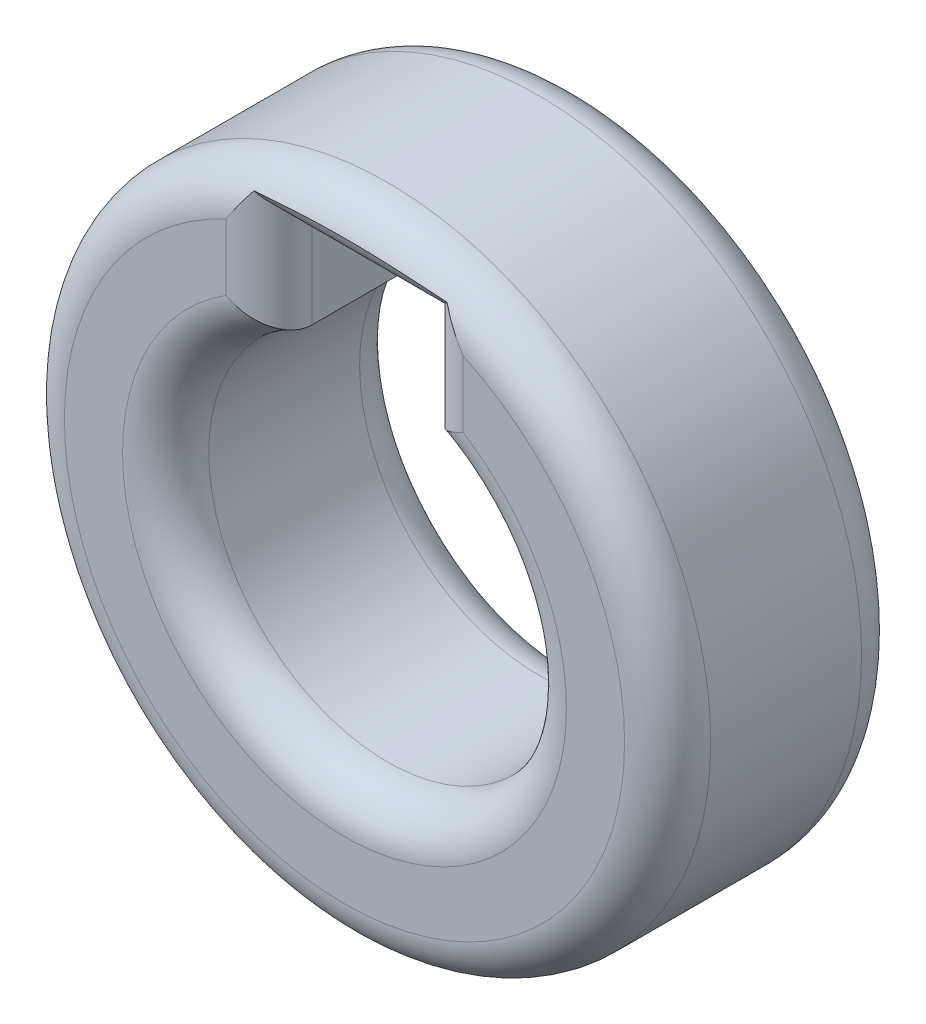
ISO-10303-21;
HEADER;
FILE_DESCRIPTION(('STEP AP214'),'2;1');
FILE_NAME('part.step','',(''),(''),'','','');
FILE_SCHEMA(('AUTOMOTIVE_DESIGN { 1 0 10303 214 1 1 1 1 }'));
ENDSEC;
DATA;
#1=APPLICATION_CONTEXT('core data for automotive mechanical design processes');
#2=APPLICATION_PROTOCOL_DEFINITION('international standard','automotive_design',2000,#1);
#3=PRODUCT_CONTEXT('',#1,'mechanical');
#4=PRODUCT('Part','Part','',(#3));
#5=PRODUCT_RELATED_PRODUCT_CATEGORY('part','',(#4));
#6=PRODUCT_DEFINITION_FORMATION('','',#4);
#7=PRODUCT_DEFINITION_CONTEXT('part definition',#1,'design');
#8=PRODUCT_DEFINITION('design','',#6,#7);
#9=PRODUCT_DEFINITION_SHAPE('','',#8);
#10=(LENGTH_UNIT() NAMED_UNIT(*) SI_UNIT(.MILLI.,.METRE.));
#11=(NAMED_UNIT(*) PLANE_ANGLE_UNIT() SI_UNIT($,.RADIAN.));
#12=(NAMED_UNIT(*) SI_UNIT($,.STERADIAN.) SOLID_ANGLE_UNIT());
#13=UNCERTAINTY_MEASURE_WITH_UNIT(LENGTH_MEASURE(1.E-05),#10,'distance_accuracy_value','');
#14=(GEOMETRIC_REPRESENTATION_CONTEXT(3) GLOBAL_UNCERTAINTY_ASSIGNED_CONTEXT((#13)) GLOBAL_UNIT_ASSIGNED_CONTEXT((#10,
#11,#12)) REPRESENTATION_CONTEXT('',''));
#15=CARTESIAN_POINT('',(0.,0.,0.));
#16=DIRECTION('',(0.,0.,1.));
#17=DIRECTION('',(1.,0.,0.));
#18=AXIS2_PLACEMENT_3D('',#15,#16,#17);
#19=CARTESIAN_POINT('',(0.,0.,5.5));
#20=DIRECTION('',(0.,0.,-1.));
#21=DIRECTION('',(-1.,0.,0.));
#22=AXIS2_PLACEMENT_3D('',#19,#20,#21);
#23=CYLINDRICAL_SURFACE('',#22,4.15);
#24=DIRECTION('',(0.,0.,-1.));
#25=VECTOR('',#24,1.);
#26=CARTESIAN_POINT('',(1.75,3.76297754444536,5.5));
#27=LINE('',#26,#25);
#28=CARTESIAN_POINT('',(1.75,3.76297754444536,4.5));
#29=VERTEX_POINT('',#28);
#30=CARTESIAN_POINT('',(1.75,3.76297754444536,1.));
#31=VERTEX_POINT('',#30);
#32=EDGE_CURVE('E212',#29,#31,#27,.T.);
#33=ORIENTED_EDGE('',*,*,#32,.T.);
#34=CARTESIAN_POINT('',(0.,0.,1.));
#35=DIRECTION('',(0.,0.,1.));
#36=DIRECTION('',(1.,0.,0.));
#37=AXIS2_PLACEMENT_3D('',#34,#35,#36);
#38=CIRCLE('',#37,4.15);
#39=CARTESIAN_POINT('',(-1.75,3.76297754444536,1.));
#40=VERTEX_POINT('',#39);
#41=EDGE_CURVE('E318',#31,#40,#38,.F.);
#42=ORIENTED_EDGE('',*,*,#41,.T.);
#43=DIRECTION('',(0.,0.,-1.));
#44=VECTOR('',#43,1.);
#45=CARTESIAN_POINT('',(-1.75,3.76297754444536,5.5));
#46=LINE('',#45,#44);
#47=CARTESIAN_POINT('',(-1.75,3.76297754444536,4.5));
#48=VERTEX_POINT('',#47);
#49=EDGE_CURVE('E334',#48,#40,#46,.T.);
#50=ORIENTED_EDGE('',*,*,#49,.F.);
#51=CARTESIAN_POINT('',(0.,0.,4.5));
#52=DIRECTION('',(0.,0.,1.));
#53=DIRECTION('',(1.,0.,0.));
#54=AXIS2_PLACEMENT_3D('',#51,#52,#53);
#55=CIRCLE('',#54,4.15);
#56=EDGE_CURVE('E316',#48,#29,#55,.T.);
#57=ORIENTED_EDGE('',*,*,#56,.T.);
#58=EDGE_LOOP('',(#33,#42,#50,#57));
#59=FACE_BOUND('',#58,.T.);
#60=ADVANCED_FACE('F43',(#59),#23,.F.);
#61=CARTESIAN_POINT('',(-1.75,0.,5.5));
#62=DIRECTION('',(-1.,0.,0.));
#63=DIRECTION('',(0.,0.,1.));
#64=AXIS2_PLACEMENT_3D('',#61,#62,#63);
#65=PLANE('',#64);
#66=ORIENTED_EDGE('',*,*,#49,.T.);
#67=DIRECTION('',(0.,1.,0.));
#68=VECTOR('',#67,1.);
#69=CARTESIAN_POINT('',(-1.75,0.,1.));
#70=LINE('',#69,#68);
#71=CARTESIAN_POINT('',(-1.75,6.15,1.));
#72=VERTEX_POINT('',#71);
#73=EDGE_CURVE('E303',#40,#72,#70,.T.);
#74=ORIENTED_EDGE('',*,*,#73,.T.);
#75=DIRECTION('',(0.,0.,-1.));
#76=VECTOR('',#75,1.);
#77=CARTESIAN_POINT('',(-1.75,6.15,5.5));
#78=LINE('',#77,#76);
#79=CARTESIAN_POINT('',(-1.75,6.15,4.5));
#80=VERTEX_POINT('',#79);
#81=EDGE_CURVE('E332',#80,#72,#78,.T.);
#82=ORIENTED_EDGE('',*,*,#81,.F.);
#83=DIRECTION('',(0.,1.,0.));
#84=VECTOR('',#83,1.);
#85=CARTESIAN_POINT('',(-1.75,3.76297754444536,4.5));
#86=LINE('',#85,#84);
#87=EDGE_CURVE('E299',#80,#48,#86,.F.);
#88=ORIENTED_EDGE('',*,*,#87,.T.);
#89=EDGE_LOOP('',(#66,#74,#82,#88));
#90=FACE_BOUND('',#89,.T.);
#91=ADVANCED_FACE('F148',(#90),#65,.F.);
#92=CARTESIAN_POINT('',(0.,6.15,5.5));
#93=DIRECTION('',(0.,1.,0.));
#94=DIRECTION('',(0.,0.,1.));
#95=AXIS2_PLACEMENT_3D('',#92,#93,#94);
#96=PLANE('',#95);
#97=ORIENTED_EDGE('',*,*,#81,.T.);
#98=DIRECTION('',(1.,0.,0.));
#99=VECTOR('',#98,1.);
#100=CARTESIAN_POINT('',(0.,6.15,1.));
#101=LINE('',#100,#99);
#102=CARTESIAN_POINT('',(1.75,6.15,1.));
#103=VERTEX_POINT('',#102);
#104=EDGE_CURVE('E238',#72,#103,#101,.T.);
#105=ORIENTED_EDGE('',*,*,#104,.T.);
#106=DIRECTION('',(0.,0.,-1.));
#107=VECTOR('',#106,1.);
#108=CARTESIAN_POINT('',(1.75,6.15,5.5));
#109=LINE('',#108,#107);
#110=CARTESIAN_POINT('',(1.75,6.15,4.5));
#111=VERTEX_POINT('',#110);
#112=EDGE_CURVE('E329',#111,#103,#109,.T.);
#113=ORIENTED_EDGE('',*,*,#112,.F.);
#114=DIRECTION('',(1.,0.,0.));
#115=VECTOR('',#114,1.);
#116=CARTESIAN_POINT('',(-1.75,6.15,4.5));
#117=LINE('',#116,#115);
#118=EDGE_CURVE('E98',#111,#80,#117,.F.);
#119=ORIENTED_EDGE('',*,*,#118,.T.);
#120=EDGE_LOOP('',(#97,#105,#113,#119));
#121=FACE_BOUND('',#120,.T.);
#122=ADVANCED_FACE('F154',(#121),#96,.F.);
#123=CARTESIAN_POINT('',(1.75,0.,5.5));
#124=DIRECTION('',(-1.,0.,0.));
#125=DIRECTION('',(0.,0.,1.));
#126=AXIS2_PLACEMENT_3D('',#123,#124,#125);
#127=PLANE('',#126);
#128=ORIENTED_EDGE('',*,*,#112,.T.);
#129=DIRECTION('',(0.,1.,0.));
#130=VECTOR('',#129,1.);
#131=CARTESIAN_POINT('',(1.75,3.76297754444536,1.));
#132=LINE('',#131,#130);
#133=EDGE_CURVE('E314',#103,#31,#132,.F.);
#134=ORIENTED_EDGE('',*,*,#133,.T.);
#135=ORIENTED_EDGE('',*,*,#32,.F.);
#136=DIRECTION('',(0.,1.,0.));
#137=VECTOR('',#136,1.);
#138=CARTESIAN_POINT('',(1.75,0.,4.5));
#139=LINE('',#138,#137);
#140=EDGE_CURVE('E312',#29,#111,#139,.T.);
#141=ORIENTED_EDGE('',*,*,#140,.T.);
#142=EDGE_LOOP('',(#128,#134,#135,#141));
#143=FACE_BOUND('',#142,.T.);
#144=ADVANCED_FACE('F328',(#143),#127,.T.);
#145=CARTESIAN_POINT('',(0.,0.,5.5));
#146=DIRECTION('',(0.,0.,-1.));
#147=DIRECTION('',(-1.,0.,0.));
#148=AXIS2_PLACEMENT_3D('',#145,#146,#147);
#149=CYLINDRICAL_SURFACE('',#148,7.5);
#150=CARTESIAN_POINT('',(0.,0.,1.));
#151=DIRECTION('',(0.,0.,1.));
#152=DIRECTION('',(1.,0.,0.));
#153=AXIS2_PLACEMENT_3D('',#150,#151,#152);
#154=CIRCLE('',#153,7.5);
#155=CARTESIAN_POINT('',(7.5,0.,1.));
#156=VERTEX_POINT('',#155);
#157=EDGE_CURVE('E342',#156,#156,#154,.T.);
#158=ORIENTED_EDGE('',*,*,#157,.T.);
#159=EDGE_LOOP('',(#158));
#160=FACE_BOUND('',#159,.T.);
#161=CARTESIAN_POINT('',(0.,0.,4.5));
#162=DIRECTION('',(0.,0.,1.));
#163=DIRECTION('',(1.,0.,0.));
#164=AXIS2_PLACEMENT_3D('',#161,#162,#163);
#165=CIRCLE('',#164,7.5);
#166=CARTESIAN_POINT('',(7.5,0.,4.5));
#167=VERTEX_POINT('',#166);
#168=EDGE_CURVE('E339',#167,#167,#165,.F.);
#169=ORIENTED_EDGE('',*,*,#168,.T.);
#170=EDGE_LOOP('',(#169));
#171=FACE_BOUND('',#170,.T.);
#172=ADVANCED_FACE('F364',(#160,#171),#149,.T.);
#173=CARTESIAN_POINT('',(0.,0.,5.5));
#174=DIRECTION('',(0.,0.,1.));
#175=DIRECTION('',(1.,0.,0.));
#176=AXIS2_PLACEMENT_3D('',#173,#174,#175);
#177=PLANE('',#176);
#178=DIRECTION('',(0.,1.,0.));
#179=VECTOR('',#178,1.);
#180=CARTESIAN_POINT('',(-2.75,6.15,5.5));
#181=LINE('',#180,#179);
#182=CARTESIAN_POINT('',(-2.75,4.35430821141545,5.5));
#183=VERTEX_POINT('',#182);
#184=CARTESIAN_POINT('',(-2.75,5.88960949469487,5.5));
#185=VERTEX_POINT('',#184);
#186=EDGE_CURVE('E292',#183,#185,#181,.T.);
#187=ORIENTED_EDGE('',*,*,#186,.T.);
#188=CARTESIAN_POINT('',(0.,0.,5.5));
#189=DIRECTION('',(0.,0.,1.));
#190=DIRECTION('',(1.,0.,0.));
#191=AXIS2_PLACEMENT_3D('',#188,#189,#190);
#192=CIRCLE('',#191,6.5);
#193=CARTESIAN_POINT('',(6.5,0.,5.5));
#194=VERTEX_POINT('',#193);
#195=EDGE_CURVE('E11',#185,#194,#192,.T.);
#196=ORIENTED_EDGE('',*,*,#195,.T.);
#197=CARTESIAN_POINT('',(0.,0.,5.5));
#198=DIRECTION('',(0.,0.,1.));
#199=DIRECTION('',(1.,0.,0.));
#200=AXIS2_PLACEMENT_3D('',#197,#198,#199);
#201=CIRCLE('',#200,6.5);
#202=CARTESIAN_POINT('',(2.75,5.88960949469487,5.5));
#203=VERTEX_POINT('',#202);
#204=EDGE_CURVE('E59',#194,#203,#201,.T.);
#205=ORIENTED_EDGE('',*,*,#204,.T.);
#206=DIRECTION('',(0.,1.,0.));
#207=VECTOR('',#206,1.);
#208=CARTESIAN_POINT('',(2.75,0.,5.5));
#209=LINE('',#208,#207);
#210=CARTESIAN_POINT('',(2.75,4.35430821141545,5.5));
#211=VERTEX_POINT('',#210);
#212=EDGE_CURVE('E107',#203,#211,#209,.F.);
#213=ORIENTED_EDGE('',*,*,#212,.T.);
#214=CARTESIAN_POINT('',(0.,0.,5.5));
#215=DIRECTION('',(0.,0.,1.));
#216=DIRECTION('',(1.,0.,0.));
#217=AXIS2_PLACEMENT_3D('',#214,#215,#216);
#218=CIRCLE('',#217,5.15);
#219=EDGE_CURVE('E295',#211,#183,#218,.F.);
#220=ORIENTED_EDGE('',*,*,#219,.T.);
#221=EDGE_LOOP('',(#187,#196,#205,#213,#220));
#222=FACE_BOUND('',#221,.T.);
#223=ADVANCED_FACE('F293',(#222),#177,.T.);
#224=CARTESIAN_POINT('',(0.,0.,0.));
#225=DIRECTION('',(0.,0.,1.));
#226=DIRECTION('',(1.,0.,0.));
#227=AXIS2_PLACEMENT_3D('',#224,#225,#226);
#228=PLANE('',#227);
#229=DIRECTION('',(0.,1.,0.));
#230=VECTOR('',#229,1.);
#231=CARTESIAN_POINT('',(2.75,6.15,0.));
#232=LINE('',#231,#230);
#233=CARTESIAN_POINT('',(2.75,4.35430821141545,0.));
#234=VERTEX_POINT('',#233);
#235=CARTESIAN_POINT('',(2.75,5.88960949469487,0.));
#236=VERTEX_POINT('',#235);
#237=EDGE_CURVE('E256',#234,#236,#232,.T.);
#238=ORIENTED_EDGE('',*,*,#237,.T.);
#239=CARTESIAN_POINT('',(0.,0.,0.));
#240=DIRECTION('',(0.,0.,1.));
#241=DIRECTION('',(1.,0.,0.));
#242=AXIS2_PLACEMENT_3D('',#239,#240,#241);
#243=CIRCLE('',#242,6.5);
#244=CARTESIAN_POINT('',(6.5,0.,0.));
#245=VERTEX_POINT('',#244);
#246=EDGE_CURVE('E252',#236,#245,#243,.F.);
#247=ORIENTED_EDGE('',*,*,#246,.T.);
#248=CARTESIAN_POINT('',(0.,0.,0.));
#249=DIRECTION('',(0.,0.,1.));
#250=DIRECTION('',(1.,0.,0.));
#251=AXIS2_PLACEMENT_3D('',#248,#249,#250);
#252=CIRCLE('',#251,6.5);
#253=CARTESIAN_POINT('',(-2.75,5.88960949469487,0.));
#254=VERTEX_POINT('',#253);
#255=EDGE_CURVE('E306',#245,#254,#252,.F.);
#256=ORIENTED_EDGE('',*,*,#255,.T.);
#257=DIRECTION('',(0.,1.,0.));
#258=VECTOR('',#257,1.);
#259=CARTESIAN_POINT('',(-2.75,0.,0.));
#260=LINE('',#259,#258);
#261=CARTESIAN_POINT('',(-2.75,4.35430821141545,0.));
#262=VERTEX_POINT('',#261);
#263=EDGE_CURVE('E245',#254,#262,#260,.F.);
#264=ORIENTED_EDGE('',*,*,#263,.T.);
#265=CARTESIAN_POINT('',(0.,0.,0.));
#266=DIRECTION('',(0.,0.,1.));
#267=DIRECTION('',(1.,0.,0.));
#268=AXIS2_PLACEMENT_3D('',#265,#266,#267);
#269=CIRCLE('',#268,5.15);
#270=EDGE_CURVE('E345',#262,#234,#269,.T.);
#271=ORIENTED_EDGE('',*,*,#270,.T.);
#272=EDGE_LOOP('',(#238,#247,#256,#264,#271));
#273=FACE_BOUND('',#272,.T.);
#274=ADVANCED_FACE('F217',(#273),#228,.F.);
#275=CARTESIAN_POINT('',(0.,0.,1.));
#276=DIRECTION('',(0.,0.,1.));
#277=DIRECTION('',(1.,0.,0.));
#278=AXIS2_PLACEMENT_3D('',#275,#276,#277);
#279=TOROIDAL_SURFACE('',#278,5.15,1.);
#280=CARTESIAN_POINT('',(1.75,3.76297754444536,1.));
#281=CARTESIAN_POINT('',(1.7499981650989,3.76297589305531,0.974890597380254));
#282=CARTESIAN_POINT('',(1.75094644884971,3.76358122590374,0.949794756188236));
#283=CARTESIAN_POINT('',(1.75471608797096,3.7659845221371,0.899812148123677));
#284=CARTESIAN_POINT('',(1.75753664559124,3.76778197757469,0.87492529677487));
#285=CARTESIAN_POINT('',(1.76872278741733,3.77490303402179,0.801112113064373));
#286=CARTESIAN_POINT('',(1.77981358390616,3.78195588829117,0.752731059950584));
#287=CARTESIAN_POINT('',(1.80867093995535,3.80022397196854,0.658959010597946));
#288=CARTESIAN_POINT('',(1.82642888829474,3.8114338320046,0.613564245804047));
#289=CARTESIAN_POINT('',(1.86783252830909,3.83741638361751,0.526605437256069));
#290=CARTESIAN_POINT('',(1.8914847766419,3.85219304222466,0.485045730538505));
#291=CARTESIAN_POINT('',(1.94547489257358,3.88568869519624,0.403960953961721));
#292=CARTESIAN_POINT('',(1.97614436825511,3.90459981472035,0.364737554324254));
#293=CARTESIAN_POINT('',(2.04213552981483,3.94495348613904,0.291943592676149));
#294=CARTESIAN_POINT('',(2.07745829740261,3.96639662650958,0.258374349184192));
#295=CARTESIAN_POINT('',(2.15737912363359,4.01448364219269,0.192621248996918));
#296=CARTESIAN_POINT('',(2.20257558601814,4.04142692787674,0.161383684127763));
#297=CARTESIAN_POINT('',(2.29671415208818,4.09695015171803,0.10697577038091));
#298=CARTESIAN_POINT('',(2.34566044392152,4.12553191063396,0.0838146070175676));
#299=CARTESIAN_POINT('',(2.45171814139658,4.18679896314791,0.0436580463607924));
#300=CARTESIAN_POINT('',(2.50913401210156,4.21958859549152,0.0276273376138794));
#301=CARTESIAN_POINT('',(2.62566587920836,4.28535578779777,0.00599809910818859));
#302=CARTESIAN_POINT('',(2.68477754786199,4.31833272237912,0.000375061453325152));
#303=CARTESIAN_POINT('',(2.74598441500649,4.35209449041624,6.03539937223928E-06));
#304=CARTESIAN_POINT('',(2.7479921732894,4.35320154529635,-1.23657262195745E-08));
#305=CARTESIAN_POINT('',(2.75,4.35430821141545,0.));
#306=B_SPLINE_CURVE_WITH_KNOTS('',3,(#280,#281,#282,#283,#284,#285,#286,#287,#288,#289,#290,
#291,#292,#293,#294,#295,#296,#297,#298,#299,#300,#301,#302,#303,#304,#305),.UNSPECIFIED.,.F.,
.F.,(4,2,2,2,2,2,2,2,2,2,2,2,4),(0.,0.0752768205510819,0.150521587254217,0.300117569183418,
0.44952099556945,0.599091361913276,0.758259120238059,0.917463944389839,1.10031467387707,
1.28337269141085,1.48666782993478,1.68948363873516,1.69636185050421),.UNSPECIFIED.);
#307=EDGE_CURVE('E221',#234,#31,#306,.F.);
#308=ORIENTED_EDGE('',*,*,#307,.F.);
#309=ORIENTED_EDGE('',*,*,#270,.F.);
#310=CARTESIAN_POINT('',(-1.75,3.76297754444536,1.));
#311=CARTESIAN_POINT('',(-1.7499981650989,3.76297589305531,0.974890597380254));
#312=CARTESIAN_POINT('',(-1.75094644884971,3.76358122590374,0.949794756188236));
#313=CARTESIAN_POINT('',(-1.75471608797096,3.7659845221371,0.899812148123677));
#314=CARTESIAN_POINT('',(-1.75753664559124,3.76778197757469,0.87492529677487));
#315=CARTESIAN_POINT('',(-1.76872278741733,3.77490303402179,0.801112113064373));
#316=CARTESIAN_POINT('',(-1.77981358390616,3.78195588829117,0.752731059950584));
#317=CARTESIAN_POINT('',(-1.80867093995535,3.80022397196854,0.658959010597946));
#318=CARTESIAN_POINT('',(-1.82642888829474,3.8114338320046,0.613564245804047));
#319=CARTESIAN_POINT('',(-1.86783252830909,3.83741638361751,0.526605437256069));
#320=CARTESIAN_POINT('',(-1.8914847766419,3.85219304222466,0.485045730538505));
#321=CARTESIAN_POINT('',(-1.94547489257358,3.88568869519624,0.403960953961721));
#322=CARTESIAN_POINT('',(-1.97614436825511,3.90459981472035,0.364737554324254));
#323=CARTESIAN_POINT('',(-2.04213552981483,3.94495348613904,0.291943592676149));
#324=CARTESIAN_POINT('',(-2.07745829740261,3.96639662650958,0.258374349184192));
#325=CARTESIAN_POINT('',(-2.15737912363359,4.01448364219269,0.192621248996918));
#326=CARTESIAN_POINT('',(-2.20257558601814,4.04142692787674,0.161383684127763));
#327=CARTESIAN_POINT('',(-2.29671415208818,4.09695015171803,0.10697577038091));
#328=CARTESIAN_POINT('',(-2.34566044392152,4.12553191063396,0.0838146070175676));
#329=CARTESIAN_POINT('',(-2.45171814139658,4.18679896314791,0.0436580463607924));
#330=CARTESIAN_POINT('',(-2.50913401210156,4.21958859549152,0.0276273376138794));
#331=CARTESIAN_POINT('',(-2.62566587920836,4.28535578779777,0.00599809910818859));
#332=CARTESIAN_POINT('',(-2.68477754786199,4.31833272237912,0.000375061453325152));
#333=CARTESIAN_POINT('',(-2.74598441500649,4.35209449041624,6.03539937223928E-06));
#334=CARTESIAN_POINT('',(-2.7479921732894,4.35320154529635,-1.23657262195745E-08));
#335=CARTESIAN_POINT('',(-2.75,4.35430821141545,0.));
#336=B_SPLINE_CURVE_WITH_KNOTS('',3,(#310,#311,#312,#313,#314,#315,#316,#317,#318,#319,#320,
#321,#322,#323,#324,#325,#326,#327,#328,#329,#330,#331,#332,#333,#334,#335),.UNSPECIFIED.,.F.,
.F.,(4,2,2,2,2,2,2,2,2,2,2,2,4),(0.,0.0752768205510819,0.150521587254217,0.300117569183418,
0.44952099556945,0.599091361913276,0.758259120238059,0.917463944389839,1.10031467387707,
1.28337269141085,1.48666782993478,1.68948363873516,1.69636185050421),.UNSPECIFIED.);
#337=EDGE_CURVE('E205',#40,#262,#336,.T.);
#338=ORIENTED_EDGE('',*,*,#337,.F.);
#339=ORIENTED_EDGE('',*,*,#41,.F.);
#340=EDGE_LOOP('',(#308,#309,#338,#339));
#341=FACE_BOUND('',#340,.T.);
#342=ADVANCED_FACE('F200',(#341),#279,.T.);
#343=CARTESIAN_POINT('',(-2.75,0.,1.));
#344=DIRECTION('',(0.,1.,0.));
#345=DIRECTION('',(0.,0.,1.));
#346=AXIS2_PLACEMENT_3D('',#343,#344,#345);
#347=CYLINDRICAL_SURFACE('',#346,1.);
#348=CARTESIAN_POINT('',(-2.75,7.15,1.));
#349=DIRECTION('',(0.707106781186547,0.707106781186547,0.));
#350=DIRECTION('',(-0.707106781186547,0.707106781186547,0.));
#351=AXIS2_PLACEMENT_3D('',#348,#349,#350);
#352=ELLIPSE('',#351,1.41421356237309,1.);
#353=CARTESIAN_POINT('',(-2.24103520856684,6.6410352085701,0.139212662102468));
#354=VERTEX_POINT('',#353);
#355=EDGE_CURVE('E213',#72,#354,#352,.T.);
#356=ORIENTED_EDGE('',*,*,#355,.F.);
#357=ORIENTED_EDGE('',*,*,#73,.F.);
#358=ORIENTED_EDGE('',*,*,#337,.T.);
#359=ORIENTED_EDGE('',*,*,#263,.F.);
#360=CARTESIAN_POINT('',(-1.86146702486486,7.1502,0.541187236339807));
#361=CARTESIAN_POINT('',(-1.87559638858256,7.13192232924319,0.513840750082381));
#362=CARTESIAN_POINT('',(-1.89060859850029,7.11243026464115,0.487846445560126));
#363=CARTESIAN_POINT('',(-1.92200808328664,7.07147550242863,0.438497403278339));
#364=CARTESIAN_POINT('',(-1.93839151885153,7.05001829212966,0.415135698691671));
#365=CARTESIAN_POINT('',(-1.98873873549848,6.98374965635293,0.349216621753408));
#366=CARTESIAN_POINT('',(-2.02424968041598,6.93659029898192,0.310186852180758));
#367=CARTESIAN_POINT('',(-2.08806390823411,6.85088771223275,0.249501855619866));
#368=CARTESIAN_POINT('',(-2.11586977643266,6.81325107882872,0.225960304296877));
#369=CARTESIAN_POINT('',(-2.17227378513499,6.73623925205052,0.183001050280347));
#370=CARTESIAN_POINT('',(-2.2008722201681,6.69686340904371,0.163584904521267));
#371=CARTESIAN_POINT('',(-2.28764468180475,6.5762857884588,0.110703324422903));
#372=CARTESIAN_POINT('',(-2.34647634606718,6.49306122046015,0.0828906173319567));
#373=CARTESIAN_POINT('',(-2.46293969864218,6.32495763589424,0.0401183996782335));
#374=CARTESIAN_POINT('',(-2.52057474590004,6.24013101085868,0.024947854916163));
#375=CARTESIAN_POINT('',(-2.63458596867698,6.06877038867327,0.00500495844337888));
#376=CARTESIAN_POINT('',(-2.69096517820919,5.98224174673416,0.000204038983962364));
#377=CARTESIAN_POINT('',(-2.74762060781749,5.89334559339342,2.12935929159164E-06));
#378=CARTESIAN_POINT('',(-2.74881051622496,5.89147765683422,7.35748526467842E-09));
#379=CARTESIAN_POINT('',(-2.75,5.88960949469487,0.));
#380=B_SPLINE_CURVE_WITH_KNOTS('',3,(#360,#361,#362,#363,#364,#365,#366,#367,#368,#369,#370,
#371,#372,#373,#374,#375,#376,#377,#378,#379),.UNSPECIFIED.,.F.,.F.,(4,2,2,2,2,2,2,2,2,4),(0.,
0.107239168736966,0.214187525933709,0.425553010555847,0.582514970787307,0.739536063897652,
1.05537339786217,1.36582643693169,1.67542309819354,1.68206731252517),.UNSPECIFIED.);
#381=EDGE_CURVE('E182',#354,#254,#380,.T.);
#382=ORIENTED_EDGE('',*,*,#381,.F.);
#383=EDGE_LOOP('',(#356,#357,#358,#359,#382));
#384=FACE_BOUND('',#383,.T.);
#385=ADVANCED_FACE('F194',(#384),#347,.T.);
#386=CARTESIAN_POINT('',(0.,7.15,1.));
#387=DIRECTION('',(1.,0.,0.));
#388=DIRECTION('',(0.,0.,-1.));
#389=AXIS2_PLACEMENT_3D('',#386,#387,#388);
#390=CYLINDRICAL_SURFACE('',#389,1.);
#391=CARTESIAN_POINT('',(2.75,7.15,1.));
#392=DIRECTION('',(0.707106781186547,-0.707106781186547,0.));
#393=DIRECTION('',(0.707106781186547,0.707106781186547,0.));
#394=AXIS2_PLACEMENT_3D('',#391,#392,#393);
#395=ELLIPSE('',#394,1.41421356237309,1.);
#396=CARTESIAN_POINT('',(2.24103520857691,6.64103520855952,0.139212662098445));
#397=VERTEX_POINT('',#396);
#398=EDGE_CURVE('E227',#103,#397,#395,.T.);
#399=ORIENTED_EDGE('',*,*,#398,.F.);
#400=ORIENTED_EDGE('',*,*,#104,.F.);
#401=ORIENTED_EDGE('',*,*,#355,.T.);
#402=CARTESIAN_POINT('',(2.7502,6.54794505347985,0.201545341693955));
#403=CARTESIAN_POINT('',(2.66168994907019,6.56577997271544,0.188126906351699));
#404=CARTESIAN_POINT('',(2.57281304207018,6.58282415497109,0.176181101154756));
#405=CARTESIAN_POINT('',(2.39448519094225,6.61527013571725,0.154746161659166));
#406=CARTESIAN_POINT('',(2.30503438897179,6.63067232546133,0.145256441352308));
#407=CARTESIAN_POINT('',(2.12576613984221,6.65976735719923,0.128247693299448));
#408=CARTESIAN_POINT('',(2.03594915148816,6.6734619014668,0.120726694666865));
#409=CARTESIAN_POINT('',(1.85594500536748,6.69912344448222,0.107296426079665));
#410=CARTESIAN_POINT('',(1.76575782230259,6.71109032307376,0.101387268200521));
#411=CARTESIAN_POINT('',(1.49660033160319,6.7441264784836,0.0857438718420197));
#412=CARTESIAN_POINT('',(1.31719673726847,6.76262990135993,0.0779325420041025));
#413=CARTESIAN_POINT('',(0.957613803214204,6.79259422016758,0.0659131291122359));
#414=CARTESIAN_POINT('',(0.777434149445223,6.80405192834414,0.0617066767064426));
#415=CARTESIAN_POINT('',(0.457847057222086,6.81803174389284,0.0566889530493467));
#416=CARTESIAN_POINT('',(0.318509381583504,6.82199549414721,0.0553222712447541));
#417=CARTESIAN_POINT('',(0.0397663944019051,6.82565356239278,0.0540592461096876));
#418=CARTESIAN_POINT('',(-0.0996389188843264,6.82534776378266,0.0541629429352361));
#419=CARTESIAN_POINT('',(-0.378342707100988,6.82046786928785,0.0558521856666706));
#420=CARTESIAN_POINT('',(-0.517641195913023,6.81589448109575,0.0574374858789529));
#421=CARTESIAN_POINT('',(-0.796004190915434,6.80249994780436,0.0622928936188718));
#422=CARTESIAN_POINT('',(-0.93506869884383,6.79367883439839,0.0655629885758535));
#423=CARTESIAN_POINT('',(-1.21501202796884,6.77165372419349,0.074258577260241));
#424=CARTESIAN_POINT('',(-1.35588455460541,6.75838229283523,0.0797175035036931));
#425=CARTESIAN_POINT('',(-1.63700591050569,6.72756288416256,0.0934506090324113));
#426=CARTESIAN_POINT('',(-1.77725482475595,6.71001550897576,0.10172439200158));
#427=CARTESIAN_POINT('',(-2.05701672758706,6.67072371563859,0.122055004412809));
#428=CARTESIAN_POINT('',(-2.19652905841934,6.64897604146417,0.134114773273839));
#429=CARTESIAN_POINT('',(-2.4049017364415,6.61332519339348,0.156096121783593));
#430=CARTESIAN_POINT('',(-2.47422816071488,6.60093301926994,0.164074472072467));
#431=CARTESIAN_POINT('',(-2.61251116753119,6.57516740245195,0.181582836807434));
#432=CARTESIAN_POINT('',(-2.68146769574352,6.56179381962532,0.191113073080079));
#433=CARTESIAN_POINT('',(-2.7502,6.54794505347985,0.201545341693955));
#434=B_SPLINE_CURVE_WITH_KNOTS('',3,(#402,#403,#404,#405,#406,#407,#408,#409,#410,#411,#412,
#413,#414,#415,#416,#417,#418,#419,#420,#421,#422,#423,#424,#425,#426,#427,#428,#429,#430,#431,
#432,#433),.UNSPECIFIED.,.F.,.F.,(4,2,2,2,2,2,2,2,2,2,2,2,2,2,2,4),(0.,0.273804043276454,
0.54754269807916,0.821006255995525,1.09448882369883,1.63585495329943,2.17746583807997,
2.59559770152166,3.01374098416145,3.4318149385954,3.84988577372517,4.27460156872759,
4.69925759084911,5.1242441324114,5.33684959075611,5.54948546564008),.UNSPECIFIED.);
#435=EDGE_CURVE('E173',#397,#354,#434,.T.);
#436=ORIENTED_EDGE('',*,*,#435,.F.);
#437=EDGE_LOOP('',(#399,#400,#401,#436));
#438=FACE_BOUND('',#437,.T.);
#439=ADVANCED_FACE('F191',(#438),#390,.T.);
#440=CARTESIAN_POINT('',(2.75,0.,1.));
#441=DIRECTION('',(0.,-1.,0.));
#442=DIRECTION('',(0.,0.,-1.));
#443=AXIS2_PLACEMENT_3D('',#440,#441,#442);
#444=CYLINDRICAL_SURFACE('',#443,1.);
#445=ORIENTED_EDGE('',*,*,#133,.F.);
#446=ORIENTED_EDGE('',*,*,#398,.T.);
#447=CARTESIAN_POINT('',(2.75,5.88960949469487,0.));
#448=CARTESIAN_POINT('',(2.74881051043422,5.89147766455764,5.32007797298615E-09));
#449=CARTESIAN_POINT('',(2.74762060208862,5.8933456010453,2.12738306745937E-06));
#450=CARTESIAN_POINT('',(2.70071696197263,5.96694059787493,0.000169362086090556));
#451=CARTESIAN_POINT('',(2.65439106383797,6.03831720605927,0.00346208293459066));
#452=CARTESIAN_POINT('',(2.56085571793216,6.17994245238073,0.0169127986039488));
#453=CARTESIAN_POINT('',(2.51364541980692,6.25018987003458,0.0270777693829511));
#454=CARTESIAN_POINT('',(2.41883066437407,6.38897089659831,0.0551327197155746));
#455=CARTESIAN_POINT('',(2.37122594913951,6.45750324289932,0.0730282230779678));
#456=CARTESIAN_POINT('',(2.27645846287534,6.59185217707716,0.117674084058889));
#457=CARTESIAN_POINT('',(2.22929509828394,6.65767300672105,0.144409970858775));
#458=CARTESIAN_POINT('',(2.14146790491958,6.77853977620299,0.204875311354873));
#459=CARTESIAN_POINT('',(2.100646121834,6.83398731821912,0.237559187944577));
#460=CARTESIAN_POINT('',(2.02182070589221,6.93985483570456,0.312474435599983));
#461=CARTESIAN_POINT('',(1.98380156465745,6.990303109871,0.354647050066971));
#462=CARTESIAN_POINT('',(1.93268409688241,7.05749746955567,0.423222539348279));
#463=CARTESIAN_POINT('',(1.91757638244943,7.07726590537562,0.445189375716632));
#464=CARTESIAN_POINT('',(1.88854159835563,7.11511355416242,0.491436887029511));
#465=CARTESIAN_POINT('',(1.87461971412045,7.13318538012686,0.515726827772982));
#466=CARTESIAN_POINT('',(1.86146702486486,7.1502,0.541187236339807));
#467=B_SPLINE_CURVE_WITH_KNOTS('',3,(#447,#448,#449,#450,#451,#452,#453,#454,#455,#456,#457,
#458,#459,#460,#461,#462,#463,#464,#465,#466),.UNSPECIFIED.,.F.,.F.,(4,2,2,2,2,2,2,2,2,4),(0.,
0.00664421433155012,0.261809321605189,0.51723383432417,0.772841161878762,1.02803214028936,
1.25609523650766,1.48278318585116,1.58222554026126,1.68208252594008),.UNSPECIFIED.);
#468=EDGE_CURVE('E166',#236,#397,#467,.T.);
#469=ORIENTED_EDGE('',*,*,#468,.F.);
#470=ORIENTED_EDGE('',*,*,#237,.F.);
#471=ORIENTED_EDGE('',*,*,#307,.T.);
#472=EDGE_LOOP('',(#445,#446,#469,#470,#471));
#473=FACE_BOUND('',#472,.T.);
#474=ADVANCED_FACE('F162',(#473),#444,.T.);
#475=CARTESIAN_POINT('',(0.,0.,1.));
#476=DIRECTION('',(0.,0.,1.));
#477=DIRECTION('',(1.,0.,0.));
#478=AXIS2_PLACEMENT_3D('',#475,#476,#477);
#479=TOROIDAL_SURFACE('',#478,6.5,1.);
#480=ORIENTED_EDGE('',*,*,#435,.T.);
#481=ORIENTED_EDGE('',*,*,#381,.T.);
#482=ORIENTED_EDGE('',*,*,#255,.F.);
#483=ORIENTED_EDGE('',*,*,#246,.F.);
#484=ORIENTED_EDGE('',*,*,#468,.T.);
#485=EDGE_LOOP('',(#480,#481,#482,#483,#484));
#486=FACE_BOUND('',#485,.T.);
#487=ORIENTED_EDGE('',*,*,#157,.F.);
#488=EDGE_LOOP('',(#487));
#489=FACE_BOUND('',#488,.T.);
#490=ADVANCED_FACE('F202',(#486,#489),#479,.T.);
#491=CARTESIAN_POINT('',(0.,0.,4.5));
#492=DIRECTION('',(0.,0.,1.));
#493=DIRECTION('',(1.,0.,0.));
#494=AXIS2_PLACEMENT_3D('',#491,#492,#493);
#495=TOROIDAL_SURFACE('',#494,5.15,1.);
#496=CARTESIAN_POINT('',(-1.75,3.76297754444536,4.5));
#497=CARTESIAN_POINT('',(-1.7499981650989,3.76297589305531,4.52510940261975));
#498=CARTESIAN_POINT('',(-1.75094644884971,3.76358122590374,4.55020524381176));
#499=CARTESIAN_POINT('',(-1.75471608797096,3.7659845221371,4.60018785187632));
#500=CARTESIAN_POINT('',(-1.75753664559124,3.76778197757469,4.62507470322513));
#501=CARTESIAN_POINT('',(-1.76872278741733,3.77490303402179,4.69888788693563));
#502=CARTESIAN_POINT('',(-1.77981358390616,3.78195588829117,4.74726894004942));
#503=CARTESIAN_POINT('',(-1.80867093995535,3.80022397196854,4.84104098940205));
#504=CARTESIAN_POINT('',(-1.82642888829474,3.8114338320046,4.88643575419595));
#505=CARTESIAN_POINT('',(-1.86783252830909,3.83741638361751,4.97339456274393));
#506=CARTESIAN_POINT('',(-1.8914847766419,3.85219304222466,5.0149542694615));
#507=CARTESIAN_POINT('',(-1.94547489257358,3.88568869519624,5.09603904603828));
#508=CARTESIAN_POINT('',(-1.97614436825511,3.90459981472035,5.13526244567575));
#509=CARTESIAN_POINT('',(-2.04213552981483,3.94495348613904,5.20805640732385));
#510=CARTESIAN_POINT('',(-2.07745829740261,3.96639662650958,5.24162565081581));
#511=CARTESIAN_POINT('',(-2.15737912363359,4.01448364219269,5.30737875100308));
#512=CARTESIAN_POINT('',(-2.20257558601814,4.04142692787674,5.33861631587224));
#513=CARTESIAN_POINT('',(-2.29671415208818,4.09695015171803,5.39302422961909));
#514=CARTESIAN_POINT('',(-2.34566044392152,4.12553191063396,5.41618539298243));
#515=CARTESIAN_POINT('',(-2.45171814139659,4.18679896314791,5.45634195363921));
#516=CARTESIAN_POINT('',(-2.50913401210156,4.21958859549152,5.47237266238612));
#517=CARTESIAN_POINT('',(-2.62566587920836,4.28535578779778,5.49400190089181));
#518=CARTESIAN_POINT('',(-2.68477754786199,4.31833272237912,5.49962493854667));
#519=CARTESIAN_POINT('',(-2.74598441500649,4.35209449041624,5.49999396460063));
#520=CARTESIAN_POINT('',(-2.7479921732894,4.35320154529635,5.50000001236573));
#521=CARTESIAN_POINT('',(-2.75,4.35430821141545,5.5));
#522=B_SPLINE_CURVE_WITH_KNOTS('',3,(#496,#497,#498,#499,#500,#501,#502,#503,#504,#505,#506,
#507,#508,#509,#510,#511,#512,#513,#514,#515,#516,#517,#518,#519,#520,#521),.UNSPECIFIED.,.F.,
.F.,(4,2,2,2,2,2,2,2,2,2,2,2,4),(0.,0.0752768205510821,0.150521587254217,0.300117569183419,
0.449520995569451,0.599091361913277,0.758259120238059,0.917463944389839,1.10031467387707,
1.28337269141085,1.48666782993478,1.68948363873516,1.69636185050421),.UNSPECIFIED.);
#523=EDGE_CURVE('E108',#183,#48,#522,.F.);
#524=ORIENTED_EDGE('',*,*,#523,.F.);
#525=ORIENTED_EDGE('',*,*,#219,.F.);
#526=CARTESIAN_POINT('',(1.75,3.76297754444536,4.5));
#527=CARTESIAN_POINT('',(1.7499981650989,3.76297589305531,4.52510940261975));
#528=CARTESIAN_POINT('',(1.75094644884971,3.76358122590374,4.55020524381176));
#529=CARTESIAN_POINT('',(1.75471608797096,3.7659845221371,4.60018785187632));
#530=CARTESIAN_POINT('',(1.75753664559124,3.76778197757469,4.62507470322513));
#531=CARTESIAN_POINT('',(1.76872278741733,3.77490303402179,4.69888788693563));
#532=CARTESIAN_POINT('',(1.77981358390616,3.78195588829117,4.74726894004942));
#533=CARTESIAN_POINT('',(1.80867093995535,3.80022397196854,4.84104098940205));
#534=CARTESIAN_POINT('',(1.82642888829474,3.8114338320046,4.88643575419595));
#535=CARTESIAN_POINT('',(1.86783252830909,3.83741638361751,4.97339456274393));
#536=CARTESIAN_POINT('',(1.8914847766419,3.85219304222466,5.0149542694615));
#537=CARTESIAN_POINT('',(1.94547489257358,3.88568869519624,5.09603904603828));
#538=CARTESIAN_POINT('',(1.97614436825511,3.90459981472035,5.13526244567575));
#539=CARTESIAN_POINT('',(2.04213552981483,3.94495348613904,5.20805640732385));
#540=CARTESIAN_POINT('',(2.07745829740261,3.96639662650958,5.24162565081581));
#541=CARTESIAN_POINT('',(2.15737912363359,4.01448364219269,5.30737875100308));
#542=CARTESIAN_POINT('',(2.20257558601814,4.04142692787674,5.33861631587224));
#543=CARTESIAN_POINT('',(2.29671415208818,4.09695015171803,5.39302422961909));
#544=CARTESIAN_POINT('',(2.34566044392152,4.12553191063396,5.41618539298243));
#545=CARTESIAN_POINT('',(2.45171814139659,4.18679896314791,5.45634195363921));
#546=CARTESIAN_POINT('',(2.50913401210156,4.21958859549152,5.47237266238612));
#547=CARTESIAN_POINT('',(2.62566587920836,4.28535578779778,5.49400190089181));
#548=CARTESIAN_POINT('',(2.68477754786199,4.31833272237912,5.49962493854667));
#549=CARTESIAN_POINT('',(2.74598441500649,4.35209449041624,5.49999396460063));
#550=CARTESIAN_POINT('',(2.7479921732894,4.35320154529635,5.50000001236573));
#551=CARTESIAN_POINT('',(2.75,4.35430821141545,5.5));
#552=B_SPLINE_CURVE_WITH_KNOTS('',3,(#526,#527,#528,#529,#530,#531,#532,#533,#534,#535,#536,
#537,#538,#539,#540,#541,#542,#543,#544,#545,#546,#547,#548,#549,#550,#551),.UNSPECIFIED.,.F.,
.F.,(4,2,2,2,2,2,2,2,2,2,2,2,4),(0.,0.0752768205510821,0.150521587254217,0.300117569183419,
0.449520995569451,0.599091361913277,0.758259120238059,0.917463944389839,1.10031467387707,
1.28337269141085,1.48666782993478,1.68948363873516,1.69636185050421),.UNSPECIFIED.);
#553=EDGE_CURVE('E48',#29,#211,#552,.T.);
#554=ORIENTED_EDGE('',*,*,#553,.F.);
#555=ORIENTED_EDGE('',*,*,#56,.F.);
#556=EDGE_LOOP('',(#524,#525,#554,#555));
#557=FACE_BOUND('',#556,.T.);
#558=ADVANCED_FACE('F45',(#557),#495,.T.);
#559=CARTESIAN_POINT('',(2.75,0.,4.5));
#560=DIRECTION('',(0.,1.,0.));
#561=DIRECTION('',(0.,0.,1.));
#562=AXIS2_PLACEMENT_3D('',#559,#560,#561);
#563=CYLINDRICAL_SURFACE('',#562,1.);
#564=CARTESIAN_POINT('',(2.75,7.15,4.5));
#565=DIRECTION('',(-0.707106781186547,0.707106781186547,0.));
#566=DIRECTION('',(0.707106781186547,0.707106781186547,0.));
#567=AXIS2_PLACEMENT_3D('',#564,#565,#566);
#568=ELLIPSE('',#567,1.41421356237309,1.);
#569=CARTESIAN_POINT('',(2.24103520856684,6.6410352085701,5.36078733789753));
#570=VERTEX_POINT('',#569);
#571=EDGE_CURVE('E90',#111,#570,#568,.T.);
#572=ORIENTED_EDGE('',*,*,#571,.F.);
#573=ORIENTED_EDGE('',*,*,#140,.F.);
#574=ORIENTED_EDGE('',*,*,#553,.T.);
#575=ORIENTED_EDGE('',*,*,#212,.F.);
#576=CARTESIAN_POINT('',(1.86146702486486,7.1502,4.95881276366019));
#577=CARTESIAN_POINT('',(1.87559638858256,7.13192232924319,4.98615924991762));
#578=CARTESIAN_POINT('',(1.89060859850029,7.11243026464115,5.01215355443987));
#579=CARTESIAN_POINT('',(1.92200808328664,7.07147550242863,5.06150259672166));
#580=CARTESIAN_POINT('',(1.93839151885153,7.05001829212966,5.08486430130833));
#581=CARTESIAN_POINT('',(1.98873873549848,6.98374965635293,5.15078337824659));
#582=CARTESIAN_POINT('',(2.02424968041598,6.93659029898192,5.18981314781924));
#583=CARTESIAN_POINT('',(2.08806390823412,6.85088771223275,5.25049814438013));
#584=CARTESIAN_POINT('',(2.11586977643266,6.81325107882872,5.27403969570312));
#585=CARTESIAN_POINT('',(2.17227378513499,6.73623925205052,5.31699894971965));
#586=CARTESIAN_POINT('',(2.20087222016811,6.69686340904371,5.33641509547873));
#587=CARTESIAN_POINT('',(2.28764468180475,6.5762857884588,5.3892966755771));
#588=CARTESIAN_POINT('',(2.34647634606719,6.49306122046015,5.41710938266804));
#589=CARTESIAN_POINT('',(2.46293969864218,6.32495763589424,5.45988160032177));
#590=CARTESIAN_POINT('',(2.52057474590005,6.24013101085868,5.47505214508384));
#591=CARTESIAN_POINT('',(2.63458596867698,6.06877038867327,5.49499504155662));
#592=CARTESIAN_POINT('',(2.69096517820918,5.98224174673415,5.49979596101604));
#593=CARTESIAN_POINT('',(2.74762060781749,5.89334559339341,5.49999787064071));
#594=CARTESIAN_POINT('',(2.74881051622496,5.89147765683422,5.49999999264251));
#595=CARTESIAN_POINT('',(2.75,5.88960949469487,5.5));
#596=B_SPLINE_CURVE_WITH_KNOTS('',3,(#576,#577,#578,#579,#580,#581,#582,#583,#584,#585,#586,
#587,#588,#589,#590,#591,#592,#593,#594,#595),.UNSPECIFIED.,.F.,.F.,(4,2,2,2,2,2,2,2,2,4),(0.,
0.107239168736966,0.214187525933709,0.425553010555848,0.582514970787309,0.739536063897655,
1.05537339786217,1.3658264369317,1.67542309819354,1.68206731252517),.UNSPECIFIED.);
#597=EDGE_CURVE('E103',#570,#203,#596,.T.);
#598=ORIENTED_EDGE('',*,*,#597,.F.);
#599=EDGE_LOOP('',(#572,#573,#574,#575,#598));
#600=FACE_BOUND('',#599,.T.);
#601=ADVANCED_FACE('F104',(#600),#563,.T.);
#602=CARTESIAN_POINT('',(0.,7.15,4.5));
#603=DIRECTION('',(-1.,0.,0.));
#604=DIRECTION('',(0.,0.,1.));
#605=AXIS2_PLACEMENT_3D('',#602,#603,#604);
#606=CYLINDRICAL_SURFACE('',#605,1.);
#607=CARTESIAN_POINT('',(-2.75,7.15,4.5));
#608=DIRECTION('',(-0.707106781186547,-0.707106781186547,0.));
#609=DIRECTION('',(-0.707106781186547,0.707106781186547,0.));
#610=AXIS2_PLACEMENT_3D('',#607,#608,#609);
#611=ELLIPSE('',#610,1.41421356237309,1.);
#612=CARTESIAN_POINT('',(-2.24103520857691,6.64103520855952,5.36078733790155));
#613=VERTEX_POINT('',#612);
#614=EDGE_CURVE('E84',#80,#613,#611,.T.);
#615=ORIENTED_EDGE('',*,*,#614,.F.);
#616=ORIENTED_EDGE('',*,*,#118,.F.);
#617=ORIENTED_EDGE('',*,*,#571,.T.);
#618=CARTESIAN_POINT('',(-2.7502,6.54794505347985,5.29845465830604));
#619=CARTESIAN_POINT('',(-2.66168994907019,6.56577997271544,5.3118730936483));
#620=CARTESIAN_POINT('',(-2.57281304207018,6.58282415497109,5.32381889884524));
#621=CARTESIAN_POINT('',(-2.39448519094225,6.61527013571725,5.34525383834083));
#622=CARTESIAN_POINT('',(-2.30503438897179,6.63067232546133,5.35474355864769));
#623=CARTESIAN_POINT('',(-2.12576613984221,6.65976735719923,5.37175230670055));
#624=CARTESIAN_POINT('',(-2.03594915148816,6.6734619014668,5.37927330533313));
#625=CARTESIAN_POINT('',(-1.85594500536748,6.69912344448222,5.39270357392033));
#626=CARTESIAN_POINT('',(-1.76575782230259,6.71109032307376,5.39861273179948));
#627=CARTESIAN_POINT('',(-1.49660033160319,6.7441264784836,5.41425612815798));
#628=CARTESIAN_POINT('',(-1.31719673726847,6.76262990135993,5.4220674579959));
#629=CARTESIAN_POINT('',(-0.957613803214203,6.79259422016757,5.43408687088776));
#630=CARTESIAN_POINT('',(-0.777434149445223,6.80405192834414,5.43829332329356));
#631=CARTESIAN_POINT('',(-0.457847057222086,6.81803174389284,5.44331104695065));
#632=CARTESIAN_POINT('',(-0.318509381583503,6.82199549414721,5.44467772875525));
#633=CARTESIAN_POINT('',(-0.0397663944019044,6.82565356239278,5.44594075389031));
#634=CARTESIAN_POINT('',(0.0996389188843272,6.82534776378266,5.44583705706476));
#635=CARTESIAN_POINT('',(0.378342707100989,6.82046786928785,5.44414781433333));
#636=CARTESIAN_POINT('',(0.517641195913024,6.81589448109575,5.44256251412105));
#637=CARTESIAN_POINT('',(0.796004190915435,6.80249994780436,5.43770710638113));
#638=CARTESIAN_POINT('',(0.935068698843831,6.79367883439839,5.43443701142415));
#639=CARTESIAN_POINT('',(1.21501202796884,6.77165372419349,5.42574142273976));
#640=CARTESIAN_POINT('',(1.35588455460541,6.75838229283523,5.42028249649631));
#641=CARTESIAN_POINT('',(1.63700591050569,6.72756288416256,5.40654939096759));
#642=CARTESIAN_POINT('',(1.77725482475595,6.71001550897576,5.39827560799842));
#643=CARTESIAN_POINT('',(2.05701672758706,6.67072371563859,5.37794499558719));
#644=CARTESIAN_POINT('',(2.19652905841934,6.64897604146417,5.36588522672616));
#645=CARTESIAN_POINT('',(2.4049017364415,6.61332519339348,5.34390387821641));
#646=CARTESIAN_POINT('',(2.47422816071488,6.60093301926994,5.33592552792753));
#647=CARTESIAN_POINT('',(2.6125111675312,6.57516740245195,5.31841716319257));
#648=CARTESIAN_POINT('',(2.68146769574352,6.56179381962532,5.30888692691992));
#649=CARTESIAN_POINT('',(2.7502,6.54794505347985,5.29845465830604));
#650=B_SPLINE_CURVE_WITH_KNOTS('',3,(#618,#619,#620,#621,#622,#623,#624,#625,#626,#627,#628,
#629,#630,#631,#632,#633,#634,#635,#636,#637,#638,#639,#640,#641,#642,#643,#644,#645,#646,#647,
#648,#649),.UNSPECIFIED.,.F.,.F.,(4,2,2,2,2,2,2,2,2,2,2,2,2,2,2,4),(0.,0.273804043276454,
0.54754269807916,0.821006255995525,1.09448882369883,1.63585495329943,2.17746583807997,
2.59559770152166,3.01374098416145,3.4318149385954,3.84988577372517,4.27460156872759,
4.69925759084911,5.1242441324114,5.33684959075611,5.54948546564008),.UNSPECIFIED.);
#651=EDGE_CURVE('E94',#613,#570,#650,.T.);
#652=ORIENTED_EDGE('',*,*,#651,.F.);
#653=EDGE_LOOP('',(#615,#616,#617,#652));
#654=FACE_BOUND('',#653,.T.);
#655=ADVANCED_FACE('F92',(#654),#606,.T.);
#656=CARTESIAN_POINT('',(-2.75,0.,4.5));
#657=DIRECTION('',(0.,-1.,0.));
#658=DIRECTION('',(0.,0.,-1.));
#659=AXIS2_PLACEMENT_3D('',#656,#657,#658);
#660=CYLINDRICAL_SURFACE('',#659,1.);
#661=ORIENTED_EDGE('',*,*,#87,.F.);
#662=ORIENTED_EDGE('',*,*,#614,.T.);
#663=CARTESIAN_POINT('',(-2.75,5.88960949469487,5.5));
#664=CARTESIAN_POINT('',(-2.74881051043422,5.89147766455764,5.49999999467992));
#665=CARTESIAN_POINT('',(-2.74762060208862,5.8933456010453,5.49999787261693));
#666=CARTESIAN_POINT('',(-2.70071696197263,5.96694059787493,5.49983063791391));
#667=CARTESIAN_POINT('',(-2.65439106383797,6.03831720605927,5.49653791706541));
#668=CARTESIAN_POINT('',(-2.56085571793216,6.17994245238073,5.48308720139605));
#669=CARTESIAN_POINT('',(-2.51364541980692,6.25018987003458,5.47292223061705));
#670=CARTESIAN_POINT('',(-2.41883066437407,6.38897089659831,5.44486728028443));
#671=CARTESIAN_POINT('',(-2.37122594913951,6.45750324289932,5.42697177692203));
#672=CARTESIAN_POINT('',(-2.27645846287534,6.59185217707716,5.38232591594111));
#673=CARTESIAN_POINT('',(-2.22929509828394,6.65767300672105,5.35559002914122));
#674=CARTESIAN_POINT('',(-2.14146790491958,6.77853977620299,5.29512468864513));
#675=CARTESIAN_POINT('',(-2.100646121834,6.83398731821912,5.26244081205542));
#676=CARTESIAN_POINT('',(-2.02182070589221,6.93985483570456,5.18752556440002));
#677=CARTESIAN_POINT('',(-1.98380156465745,6.990303109871,5.14535294993303));
#678=CARTESIAN_POINT('',(-1.93268409688241,7.05749746955567,5.07677746065172));
#679=CARTESIAN_POINT('',(-1.91757638244943,7.07726590537562,5.05481062428337));
#680=CARTESIAN_POINT('',(-1.88854159835563,7.11511355416242,5.00856311297049));
#681=CARTESIAN_POINT('',(-1.87461971412045,7.13318538012686,4.98427317222702));
#682=CARTESIAN_POINT('',(-1.86146702486486,7.1502,4.95881276366019));
#683=B_SPLINE_CURVE_WITH_KNOTS('',3,(#663,#664,#665,#666,#667,#668,#669,#670,#671,#672,#673,
#674,#675,#676,#677,#678,#679,#680,#681,#682),.UNSPECIFIED.,.F.,.F.,(4,2,2,2,2,2,2,2,2,4),(0.,
0.00664421433155012,0.261809321605188,0.517233834324171,0.772841161878762,1.02803214028936,
1.25609523650766,1.48278318585116,1.58222554026126,1.68208252594008),.UNSPECIFIED.);
#684=EDGE_CURVE('E111',#185,#613,#683,.T.);
#685=ORIENTED_EDGE('',*,*,#684,.F.);
#686=ORIENTED_EDGE('',*,*,#186,.F.);
#687=ORIENTED_EDGE('',*,*,#523,.T.);
#688=EDGE_LOOP('',(#661,#662,#685,#686,#687));
#689=FACE_BOUND('',#688,.T.);
#690=ADVANCED_FACE('F136',(#689),#660,.T.);
#691=CARTESIAN_POINT('',(0.,0.,4.5));
#692=DIRECTION('',(0.,0.,1.));
#693=DIRECTION('',(1.,0.,0.));
#694=AXIS2_PLACEMENT_3D('',#691,#692,#693);
#695=TOROIDAL_SURFACE('',#694,6.5,1.);
#696=ORIENTED_EDGE('',*,*,#168,.F.);
#697=EDGE_LOOP('',(#696));
#698=FACE_BOUND('',#697,.T.);
#699=ORIENTED_EDGE('',*,*,#651,.T.);
#700=ORIENTED_EDGE('',*,*,#597,.T.);
#701=ORIENTED_EDGE('',*,*,#204,.F.);
#702=ORIENTED_EDGE('',*,*,#195,.F.);
#703=ORIENTED_EDGE('',*,*,#684,.T.);
#704=EDGE_LOOP('',(#699,#700,#701,#702,#703));
#705=FACE_BOUND('',#704,.T.);
#706=ADVANCED_FACE('F110',(#698,#705),#695,.T.);
#707=CLOSED_SHELL('',(#60,#91,#122,#144,#172,#223,#274,#342,#385,#439,#474,#490,#558,#601,#655,
#690,#706));
#708=MANIFOLD_SOLID_BREP('B2',#707);
#709=ADVANCED_BREP_SHAPE_REPRESENTATION('',(#18,#708),#14);
#710=SHAPE_DEFINITION_REPRESENTATION(#9,#709);
ENDSEC;
END-ISO-10303-21;
